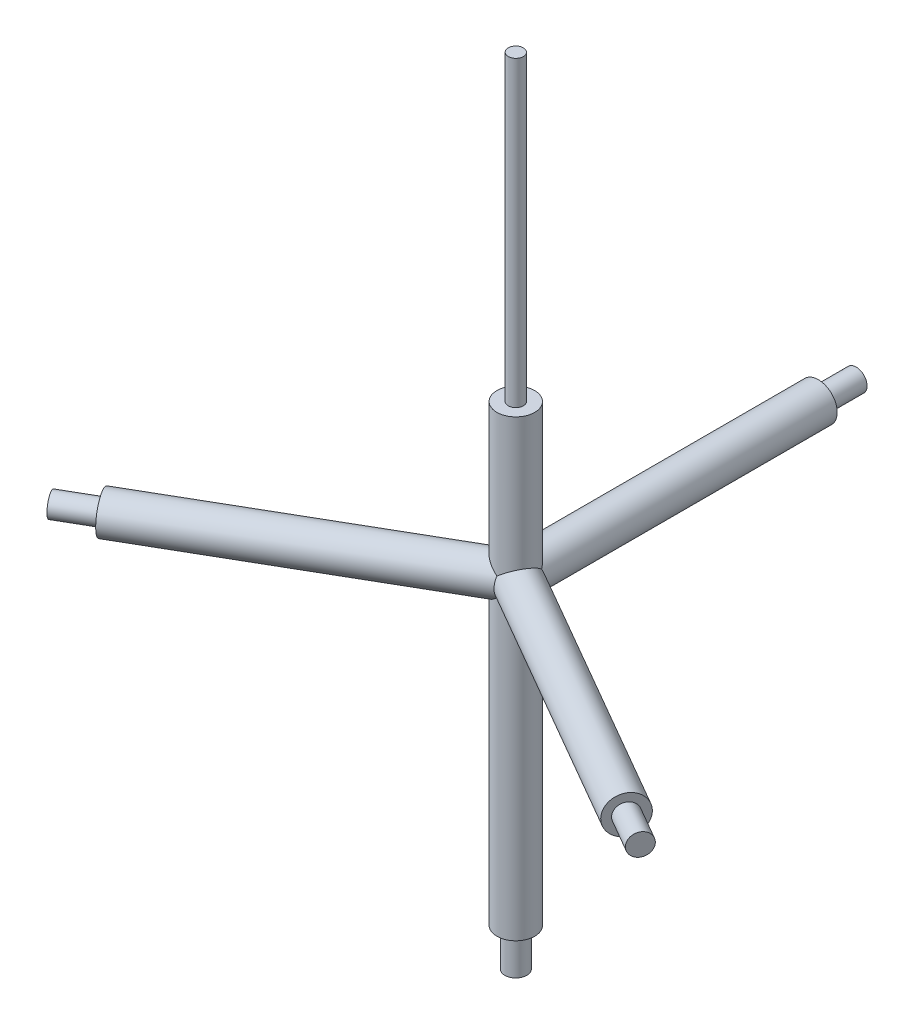
ISO-10303-21;
HEADER;
FILE_DESCRIPTION(('STEP AP214'),'2;1');
FILE_NAME('part.step','',(''),(''),'','','');
FILE_SCHEMA(('AUTOMOTIVE_DESIGN { 1 0 10303 214 1 1 1 1 }'));
ENDSEC;
DATA;
#1=APPLICATION_CONTEXT('core data for automotive mechanical design processes');
#2=APPLICATION_PROTOCOL_DEFINITION('international standard','automotive_design',2000,#1);
#3=PRODUCT_CONTEXT('',#1,'mechanical');
#4=PRODUCT('Part','Part','',(#3));
#5=PRODUCT_RELATED_PRODUCT_CATEGORY('part','',(#4));
#6=PRODUCT_DEFINITION_FORMATION('','',#4);
#7=PRODUCT_DEFINITION_CONTEXT('part definition',#1,'design');
#8=PRODUCT_DEFINITION('design','',#6,#7);
#9=PRODUCT_DEFINITION_SHAPE('','',#8);
#10=(LENGTH_UNIT() NAMED_UNIT(*) SI_UNIT(.MILLI.,.METRE.));
#11=(NAMED_UNIT(*) PLANE_ANGLE_UNIT() SI_UNIT($,.RADIAN.));
#12=(NAMED_UNIT(*) SI_UNIT($,.STERADIAN.) SOLID_ANGLE_UNIT());
#13=UNCERTAINTY_MEASURE_WITH_UNIT(LENGTH_MEASURE(1.E-05),#10,'distance_accuracy_value','');
#14=(GEOMETRIC_REPRESENTATION_CONTEXT(3) GLOBAL_UNCERTAINTY_ASSIGNED_CONTEXT((#13)) GLOBAL_UNIT_ASSIGNED_CONTEXT((#10,
#11,#12)) REPRESENTATION_CONTEXT('',''));
#15=CARTESIAN_POINT('',(0.,0.,0.));
#16=DIRECTION('',(0.,0.,1.));
#17=DIRECTION('',(1.,0.,0.));
#18=AXIS2_PLACEMENT_3D('',#15,#16,#17);
#19=CARTESIAN_POINT('',(0.,0.,0.));
#20=DIRECTION('',(0.,0.,1.));
#21=DIRECTION('',(1.,0.,0.));
#22=AXIS2_PLACEMENT_3D('',#19,#20,#21);
#23=CYLINDRICAL_SURFACE('',#22,2.5);
#24=CARTESIAN_POINT('',(0.,0.,0.));
#25=DIRECTION('',(0.,0.707106781186547,0.707106781186547));
#26=DIRECTION('',(0.,-0.707106781186547,0.707106781186547));
#27=AXIS2_PLACEMENT_3D('',#24,#25,#26);
#28=ELLIPSE('',#27,3.53553390593274,2.5);
#29=CARTESIAN_POINT('',(2.16506350946109,1.25000000000002,-1.25000000000001));
#30=VERTEX_POINT('',#29);
#31=CARTESIAN_POINT('',(-2.1650635094611,1.24999999999999,-1.25));
#32=VERTEX_POINT('',#31);
#33=EDGE_CURVE('E111',#30,#32,#28,.T.);
#34=ORIENTED_EDGE('',*,*,#33,.F.);
#35=CARTESIAN_POINT('',(0.,0.,0.));
#36=DIRECTION('',(0.500000000000004,0.,0.866025403784436));
#37=DIRECTION('',(-0.866025403784436,0.,0.500000000000004));
#38=AXIS2_PLACEMENT_3D('',#35,#36,#37);
#39=ELLIPSE('',#38,2.88675134594814,2.5);
#40=CARTESIAN_POINT('',(2.16506350946109,-1.25000000000001,-1.25000000000001));
#41=VERTEX_POINT('',#40);
#42=EDGE_CURVE('E106',#41,#30,#39,.T.);
#43=ORIENTED_EDGE('',*,*,#42,.F.);
#44=CARTESIAN_POINT('',(0.,0.,0.));
#45=DIRECTION('',(0.,-0.707106781186547,0.707106781186547));
#46=DIRECTION('',(0.,0.707106781186547,0.707106781186547));
#47=AXIS2_PLACEMENT_3D('',#44,#45,#46);
#48=ELLIPSE('',#47,3.53553390593274,2.5);
#49=CARTESIAN_POINT('',(-2.1650635094611,-1.24999999999999,-1.25));
#50=VERTEX_POINT('',#49);
#51=EDGE_CURVE('E53',#50,#41,#48,.T.);
#52=ORIENTED_EDGE('',*,*,#51,.F.);
#53=CARTESIAN_POINT('',(0.,0.,0.));
#54=DIRECTION('',(-0.499999999999998,0.,0.86602540378444));
#55=DIRECTION('',(0.86602540378444,0.,0.499999999999998));
#56=AXIS2_PLACEMENT_3D('',#53,#54,#55);
#57=ELLIPSE('',#56,2.88675134594813,2.5);
#58=EDGE_CURVE('E86',#32,#50,#57,.T.);
#59=ORIENTED_EDGE('',*,*,#58,.F.);
#60=EDGE_LOOP('',(#34,#43,#52,#59));
#61=FACE_BOUND('',#60,.T.);
#62=CARTESIAN_POINT('',(0.,0.,-40.));
#63=DIRECTION('',(0.,0.,1.));
#64=DIRECTION('',(1.,0.,0.));
#65=AXIS2_PLACEMENT_3D('',#62,#63,#64);
#66=CIRCLE('',#65,2.5);
#67=CARTESIAN_POINT('',(2.5,0.,-40.));
#68=VERTEX_POINT('',#67);
#69=EDGE_CURVE('E94',#68,#68,#66,.T.);
#70=ORIENTED_EDGE('',*,*,#69,.T.);
#71=EDGE_LOOP('',(#70));
#72=FACE_BOUND('',#71,.T.);
#73=ADVANCED_FACE('F37',(#61,#72),#23,.T.);
#74=CARTESIAN_POINT('',(0.,0.,-40.));
#75=DIRECTION('',(0.,0.,1.));
#76=DIRECTION('',(1.,0.,0.));
#77=AXIS2_PLACEMENT_3D('',#74,#75,#76);
#78=PLANE('',#77);
#79=CARTESIAN_POINT('',(0.,0.,-40.));
#80=DIRECTION('',(0.,0.,-1.));
#81=DIRECTION('',(-1.,0.,0.));
#82=AXIS2_PLACEMENT_3D('',#79,#80,#81);
#83=CIRCLE('',#82,1.45);
#84=CARTESIAN_POINT('',(-1.45,0.,-40.));
#85=VERTEX_POINT('',#84);
#86=EDGE_CURVE('E80',#85,#85,#83,.T.);
#87=ORIENTED_EDGE('',*,*,#86,.F.);
#88=EDGE_LOOP('',(#87));
#89=FACE_BOUND('',#88,.T.);
#90=ORIENTED_EDGE('',*,*,#69,.F.);
#91=EDGE_LOOP('',(#90));
#92=FACE_BOUND('',#91,.T.);
#93=ADVANCED_FACE('F166',(#89,#92),#78,.F.);
#94=CARTESIAN_POINT('',(0.,0.,-45.));
#95=DIRECTION('',(0.,0.,1.));
#96=DIRECTION('',(1.,0.,0.));
#97=AXIS2_PLACEMENT_3D('',#94,#95,#96);
#98=CYLINDRICAL_SURFACE('',#97,1.45);
#99=CARTESIAN_POINT('',(0.,0.,-45.));
#100=DIRECTION('',(0.,0.,-1.));
#101=DIRECTION('',(-1.,0.,0.));
#102=AXIS2_PLACEMENT_3D('',#99,#100,#101);
#103=CIRCLE('',#102,1.45);
#104=CARTESIAN_POINT('',(-1.45,0.,-45.));
#105=VERTEX_POINT('',#104);
#106=EDGE_CURVE('E97',#105,#105,#103,.T.);
#107=ORIENTED_EDGE('',*,*,#106,.F.);
#108=EDGE_LOOP('',(#107));
#109=FACE_BOUND('',#108,.T.);
#110=ORIENTED_EDGE('',*,*,#86,.T.);
#111=EDGE_LOOP('',(#110));
#112=FACE_BOUND('',#111,.T.);
#113=ADVANCED_FACE('F170',(#109,#112),#98,.T.);
#114=CARTESIAN_POINT('',(0.,0.,-45.));
#115=DIRECTION('',(0.,0.,-1.));
#116=DIRECTION('',(-1.,0.,0.));
#117=AXIS2_PLACEMENT_3D('',#114,#115,#116);
#118=PLANE('',#117);
#119=ORIENTED_EDGE('',*,*,#106,.T.);
#120=EDGE_LOOP('',(#119));
#121=FACE_BOUND('',#120,.T.);
#122=ADVANCED_FACE('F279',(#121),#118,.T.);
#123=CARTESIAN_POINT('',(0.,0.,0.));
#124=DIRECTION('',(0.866025403784436,0.,-0.500000000000004));
#125=DIRECTION('',(-0.500000000000004,0.,-0.866025403784436));
#126=AXIS2_PLACEMENT_3D('',#123,#124,#125);
#127=CYLINDRICAL_SURFACE('',#126,2.5);
#128=CARTESIAN_POINT('',(0.,0.,0.));
#129=DIRECTION('',(0.612372435695792,0.707106781186549,-0.353553390593276));
#130=DIRECTION('',(0.612372435695794,-0.707106781186546,-0.353553390593277));
#131=AXIS2_PLACEMENT_3D('',#128,#129,#130);
#132=ELLIPSE('',#131,3.53553390593273,2.5);
#133=CARTESIAN_POINT('',(0.,1.25,2.5));
#134=VERTEX_POINT('',#133);
#135=EDGE_CURVE('E60',#32,#134,#132,.T.);
#136=ORIENTED_EDGE('',*,*,#135,.F.);
#137=ORIENTED_EDGE('',*,*,#58,.T.);
#138=CARTESIAN_POINT('',(0.,0.,0.));
#139=DIRECTION('',(0.612372435695794,-0.707106781186546,-0.353553390593277));
#140=DIRECTION('',(0.612372435695792,0.707106781186549,-0.353553390593276));
#141=AXIS2_PLACEMENT_3D('',#138,#139,#140);
#142=ELLIPSE('',#141,3.53553390593274,2.5);
#143=CARTESIAN_POINT('',(0.,-1.25,2.5));
#144=VERTEX_POINT('',#143);
#145=EDGE_CURVE('E83',#144,#50,#142,.T.);
#146=ORIENTED_EDGE('',*,*,#145,.F.);
#147=CARTESIAN_POINT('',(0.,0.,0.));
#148=DIRECTION('',(1.,0.,0.));
#149=DIRECTION('',(0.,0.,-1.));
#150=AXIS2_PLACEMENT_3D('',#147,#148,#149);
#151=ELLIPSE('',#150,2.88675134594813,2.5);
#152=EDGE_CURVE('E73',#134,#144,#151,.T.);
#153=ORIENTED_EDGE('',*,*,#152,.F.);
#154=EDGE_LOOP('',(#136,#137,#146,#153));
#155=FACE_BOUND('',#154,.T.);
#156=CARTESIAN_POINT('',(-34.6410161513775,-1.20948461451098E-13,20.0000000000002));
#157=DIRECTION('',(0.866025403784436,0.,-0.500000000000004));
#158=DIRECTION('',(-0.500000000000004,0.,-0.866025403784436));
#159=AXIS2_PLACEMENT_3D('',#156,#157,#158);
#160=CIRCLE('',#159,2.5);
#161=CARTESIAN_POINT('',(-35.8910161513775,-1.3404151647176E-13,17.8349364905391));
#162=VERTEX_POINT('',#161);
#163=EDGE_CURVE('E103',#162,#162,#160,.T.);
#164=ORIENTED_EDGE('',*,*,#163,.T.);
#165=EDGE_LOOP('',(#164));
#166=FACE_BOUND('',#165,.T.);
#167=ADVANCED_FACE('F84',(#155,#166),#127,.T.);
#168=CARTESIAN_POINT('',(-34.6410161513775,-1.20948461451098E-13,20.0000000000002));
#169=DIRECTION('',(0.866025403784436,0.,-0.500000000000004));
#170=DIRECTION('',(-0.500000000000004,0.,-0.866025403784436));
#171=AXIS2_PLACEMENT_3D('',#168,#169,#170);
#172=PLANE('',#171);
#173=CARTESIAN_POINT('',(-34.6410161513775,-1.20948461451098E-13,20.0000000000002));
#174=DIRECTION('',(-0.866025403784436,0.,0.500000000000004));
#175=DIRECTION('',(0.500000000000004,0.,0.866025403784436));
#176=AXIS2_PLACEMENT_3D('',#173,#174,#175);
#177=CIRCLE('',#176,1.45);
#178=CARTESIAN_POINT('',(-33.9160161513775,-1.13354489539114E-13,21.2557368354876));
#179=VERTEX_POINT('',#178);
#180=EDGE_CURVE('E124',#179,#179,#177,.T.);
#181=ORIENTED_EDGE('',*,*,#180,.F.);
#182=EDGE_LOOP('',(#181));
#183=FACE_BOUND('',#182,.T.);
#184=ORIENTED_EDGE('',*,*,#163,.F.);
#185=EDGE_LOOP('',(#184));
#186=FACE_BOUND('',#185,.T.);
#187=ADVANCED_FACE('F268',(#183,#186),#172,.F.);
#188=CARTESIAN_POINT('',(0.,0.,0.));
#189=DIRECTION('',(-0.866025403784443,0.,-0.499999999999992));
#190=DIRECTION('',(-0.499999999999992,0.,0.866025403784443));
#191=AXIS2_PLACEMENT_3D('',#188,#189,#190);
#192=CYLINDRICAL_SURFACE('',#191,2.5);
#193=CARTESIAN_POINT('',(0.,0.,0.));
#194=DIRECTION('',(-0.612372435695799,0.707106781186546,-0.353553390593269));
#195=DIRECTION('',(-0.612372435695797,-0.707106781186549,-0.353553390593268));
#196=AXIS2_PLACEMENT_3D('',#193,#194,#195);
#197=ELLIPSE('',#196,3.53553390593274,2.5);
#198=EDGE_CURVE('E40',#134,#30,#197,.T.);
#199=ORIENTED_EDGE('',*,*,#198,.F.);
#200=ORIENTED_EDGE('',*,*,#152,.T.);
#201=CARTESIAN_POINT('',(0.,0.,0.));
#202=DIRECTION('',(-0.612372435695797,-0.707106781186549,-0.353553390593268));
#203=DIRECTION('',(-0.612372435695799,0.707106781186546,-0.353553390593269));
#204=AXIS2_PLACEMENT_3D('',#201,#202,#203);
#205=ELLIPSE('',#204,3.53553390593273,2.5);
#206=EDGE_CURVE('E78',#41,#144,#205,.T.);
#207=ORIENTED_EDGE('',*,*,#206,.F.);
#208=ORIENTED_EDGE('',*,*,#42,.T.);
#209=EDGE_LOOP('',(#199,#200,#207,#208));
#210=FACE_BOUND('',#209,.T.);
#211=CARTESIAN_POINT('',(34.6410161513777,1.20948461451099E-13,19.9999999999997));
#212=DIRECTION('',(-0.866025403784443,0.,-0.499999999999992));
#213=DIRECTION('',(-0.499999999999992,0.,0.866025403784443));
#214=AXIS2_PLACEMENT_3D('',#211,#212,#213);
#215=CIRCLE('',#214,2.5);
#216=CARTESIAN_POINT('',(33.3910161513778,1.07855406430437E-13,22.1650635094608));
#217=VERTEX_POINT('',#216);
#218=EDGE_CURVE('E108',#217,#217,#215,.T.);
#219=ORIENTED_EDGE('',*,*,#218,.T.);
#220=EDGE_LOOP('',(#219));
#221=FACE_BOUND('',#220,.T.);
#222=ADVANCED_FACE('F75',(#210,#221),#192,.T.);
#223=CARTESIAN_POINT('',(34.6410161513777,1.20948461451099E-13,19.9999999999997));
#224=DIRECTION('',(-0.866025403784443,0.,-0.499999999999992));
#225=DIRECTION('',(-0.499999999999992,0.,0.866025403784443));
#226=AXIS2_PLACEMENT_3D('',#223,#224,#225);
#227=PLANE('',#226);
#228=CARTESIAN_POINT('',(34.6410161513777,1.20948461451099E-13,19.9999999999997));
#229=DIRECTION('',(0.866025403784443,0.,0.499999999999992));
#230=DIRECTION('',(0.499999999999992,0.,-0.866025403784443));
#231=AXIS2_PLACEMENT_3D('',#228,#229,#230);
#232=CIRCLE('',#231,1.45);
#233=CARTESIAN_POINT('',(35.3660161513777,1.28542433363083E-13,18.7442631645122));
#234=VERTEX_POINT('',#233);
#235=EDGE_CURVE('E45',#234,#234,#232,.T.);
#236=ORIENTED_EDGE('',*,*,#235,.F.);
#237=EDGE_LOOP('',(#236));
#238=FACE_BOUND('',#237,.T.);
#239=ORIENTED_EDGE('',*,*,#218,.F.);
#240=EDGE_LOOP('',(#239));
#241=FACE_BOUND('',#240,.T.);
#242=ADVANCED_FACE('F153',(#238,#241),#227,.F.);
#243=CARTESIAN_POINT('',(0.,-40.,0.));
#244=DIRECTION('',(0.,1.,0.));
#245=DIRECTION('',(0.,0.,1.));
#246=AXIS2_PLACEMENT_3D('',#243,#244,#245);
#247=PLANE('',#246);
#248=CARTESIAN_POINT('',(0.,-40.,0.));
#249=DIRECTION('',(0.,-1.,0.));
#250=DIRECTION('',(0.,0.,-1.));
#251=AXIS2_PLACEMENT_3D('',#248,#249,#250);
#252=CIRCLE('',#251,1.45);
#253=CARTESIAN_POINT('',(0.,-40.,-1.45));
#254=VERTEX_POINT('',#253);
#255=EDGE_CURVE('E11',#254,#254,#252,.T.);
#256=ORIENTED_EDGE('',*,*,#255,.F.);
#257=EDGE_LOOP('',(#256));
#258=FACE_BOUND('',#257,.T.);
#259=CARTESIAN_POINT('',(0.,-40.,0.));
#260=DIRECTION('',(0.,1.,0.));
#261=DIRECTION('',(0.,0.,1.));
#262=AXIS2_PLACEMENT_3D('',#259,#260,#261);
#263=CIRCLE('',#262,2.5);
#264=CARTESIAN_POINT('',(0.,-40.,2.5));
#265=VERTEX_POINT('',#264);
#266=EDGE_CURVE('E88',#265,#265,#263,.T.);
#267=ORIENTED_EDGE('',*,*,#266,.F.);
#268=EDGE_LOOP('',(#267));
#269=FACE_BOUND('',#268,.T.);
#270=ADVANCED_FACE('F150',(#258,#269),#247,.F.);
#271=CARTESIAN_POINT('',(0.,-40.,0.));
#272=DIRECTION('',(0.,1.,0.));
#273=DIRECTION('',(0.,0.,1.));
#274=AXIS2_PLACEMENT_3D('',#271,#272,#273);
#275=CYLINDRICAL_SURFACE('',#274,2.5);
#276=ORIENTED_EDGE('',*,*,#145,.T.);
#277=ORIENTED_EDGE('',*,*,#51,.T.);
#278=ORIENTED_EDGE('',*,*,#206,.T.);
#279=EDGE_LOOP('',(#276,#277,#278));
#280=FACE_BOUND('',#279,.T.);
#281=ORIENTED_EDGE('',*,*,#266,.T.);
#282=EDGE_LOOP('',(#281));
#283=FACE_BOUND('',#282,.T.);
#284=ADVANCED_FACE('F90',(#280,#283),#275,.T.);
#285=ORIENTED_EDGE('',*,*,#198,.T.);
#286=ORIENTED_EDGE('',*,*,#33,.T.);
#287=ORIENTED_EDGE('',*,*,#135,.T.);
#288=EDGE_LOOP('',(#285,#286,#287));
#289=FACE_BOUND('',#288,.T.);
#290=CARTESIAN_POINT('',(0.,20.,0.));
#291=DIRECTION('',(0.,1.,0.));
#292=DIRECTION('',(0.,0.,1.));
#293=AXIS2_PLACEMENT_3D('',#290,#291,#292);
#294=CIRCLE('',#293,2.5);
#295=CARTESIAN_POINT('',(0.,20.,2.5));
#296=VERTEX_POINT('',#295);
#297=EDGE_CURVE('E118',#296,#296,#294,.T.);
#298=ORIENTED_EDGE('',*,*,#297,.F.);
#299=EDGE_LOOP('',(#298));
#300=FACE_BOUND('',#299,.T.);
#301=ADVANCED_FACE('F157',(#289,#300),#275,.T.);
#302=CARTESIAN_POINT('',(0.,20.,0.));
#303=DIRECTION('',(0.,1.,0.));
#304=DIRECTION('',(0.,0.,1.));
#305=AXIS2_PLACEMENT_3D('',#302,#303,#304);
#306=PLANE('',#305);
#307=CARTESIAN_POINT('',(0.,20.,0.));
#308=DIRECTION('',(0.,1.,0.));
#309=DIRECTION('',(0.,0.,1.));
#310=AXIS2_PLACEMENT_3D('',#307,#308,#309);
#311=CIRCLE('',#310,1.);
#312=CARTESIAN_POINT('',(0.,20.,1.));
#313=VERTEX_POINT('',#312);
#314=EDGE_CURVE('E92',#313,#313,#311,.T.);
#315=ORIENTED_EDGE('',*,*,#314,.F.);
#316=EDGE_LOOP('',(#315));
#317=FACE_BOUND('',#316,.T.);
#318=ORIENTED_EDGE('',*,*,#297,.T.);
#319=EDGE_LOOP('',(#318));
#320=FACE_BOUND('',#319,.T.);
#321=ADVANCED_FACE('F162',(#317,#320),#306,.T.);
#322=CARTESIAN_POINT('',(0.,60.,0.));
#323=DIRECTION('',(0.,-1.,0.));
#324=DIRECTION('',(0.,0.,-1.));
#325=AXIS2_PLACEMENT_3D('',#322,#323,#324);
#326=CYLINDRICAL_SURFACE('',#325,1.);
#327=CARTESIAN_POINT('',(0.,60.,0.));
#328=DIRECTION('',(0.,1.,0.));
#329=DIRECTION('',(0.,0.,1.));
#330=AXIS2_PLACEMENT_3D('',#327,#328,#329);
#331=CIRCLE('',#330,1.);
#332=CARTESIAN_POINT('',(0.,60.,1.));
#333=VERTEX_POINT('',#332);
#334=EDGE_CURVE('E121',#333,#333,#331,.T.);
#335=ORIENTED_EDGE('',*,*,#334,.F.);
#336=EDGE_LOOP('',(#335));
#337=FACE_BOUND('',#336,.T.);
#338=ORIENTED_EDGE('',*,*,#314,.T.);
#339=EDGE_LOOP('',(#338));
#340=FACE_BOUND('',#339,.T.);
#341=ADVANCED_FACE('F180',(#337,#340),#326,.T.);
#342=CARTESIAN_POINT('',(0.,60.,0.));
#343=DIRECTION('',(0.,1.,0.));
#344=DIRECTION('',(0.,0.,1.));
#345=AXIS2_PLACEMENT_3D('',#342,#343,#344);
#346=PLANE('',#345);
#347=ORIENTED_EDGE('',*,*,#334,.T.);
#348=EDGE_LOOP('',(#347));
#349=FACE_BOUND('',#348,.T.);
#350=ADVANCED_FACE('F186',(#349),#346,.T.);
#351=CARTESIAN_POINT('',(-38.9711431702996,-1.36067019132485E-13,22.5000000000002));
#352=DIRECTION('',(0.866025403784436,0.,-0.500000000000004));
#353=DIRECTION('',(-0.500000000000004,0.,-0.866025403784436));
#354=AXIS2_PLACEMENT_3D('',#351,#352,#353);
#355=CYLINDRICAL_SURFACE('',#354,1.45);
#356=CARTESIAN_POINT('',(-38.9711431702996,-1.36067019132485E-13,22.5000000000002));
#357=DIRECTION('',(-0.866025403784436,0.,0.500000000000004));
#358=DIRECTION('',(0.500000000000004,0.,0.866025403784436));
#359=AXIS2_PLACEMENT_3D('',#356,#357,#358);
#360=CIRCLE('',#359,1.45);
#361=CARTESIAN_POINT('',(-38.2461431702996,-1.28473047220501E-13,23.7557368354876));
#362=VERTEX_POINT('',#361);
#363=EDGE_CURVE('E127',#362,#362,#360,.T.);
#364=ORIENTED_EDGE('',*,*,#363,.F.);
#365=EDGE_LOOP('',(#364));
#366=FACE_BOUND('',#365,.T.);
#367=ORIENTED_EDGE('',*,*,#180,.T.);
#368=EDGE_LOOP('',(#367));
#369=FACE_BOUND('',#368,.T.);
#370=ADVANCED_FACE('F193',(#366,#369),#355,.T.);
#371=CARTESIAN_POINT('',(-38.9711431702996,-1.36067019132485E-13,22.5000000000002));
#372=DIRECTION('',(-0.866025403784436,0.,0.500000000000004));
#373=DIRECTION('',(0.500000000000004,0.,0.866025403784436));
#374=AXIS2_PLACEMENT_3D('',#371,#372,#373);
#375=PLANE('',#374);
#376=ORIENTED_EDGE('',*,*,#363,.T.);
#377=EDGE_LOOP('',(#376));
#378=FACE_BOUND('',#377,.T.);
#379=ADVANCED_FACE('F197',(#378),#375,.T.);
#380=CARTESIAN_POINT('',(38.9711431702999,1.36067019132486E-13,22.4999999999996));
#381=DIRECTION('',(-0.866025403784443,0.,-0.499999999999992));
#382=DIRECTION('',(-0.499999999999992,0.,0.866025403784443));
#383=AXIS2_PLACEMENT_3D('',#380,#381,#382);
#384=CYLINDRICAL_SURFACE('',#383,1.45);
#385=CARTESIAN_POINT('',(38.9711431702999,1.36067019132486E-13,22.4999999999996));
#386=DIRECTION('',(0.866025403784443,0.,0.499999999999992));
#387=DIRECTION('',(0.499999999999992,0.,-0.866025403784443));
#388=AXIS2_PLACEMENT_3D('',#385,#386,#387);
#389=CIRCLE('',#388,1.45);
#390=CARTESIAN_POINT('',(39.6961431702999,1.4366099104447E-13,21.2442631645122));
#391=VERTEX_POINT('',#390);
#392=EDGE_CURVE('E132',#391,#391,#389,.T.);
#393=ORIENTED_EDGE('',*,*,#392,.F.);
#394=EDGE_LOOP('',(#393));
#395=FACE_BOUND('',#394,.T.);
#396=ORIENTED_EDGE('',*,*,#235,.T.);
#397=EDGE_LOOP('',(#396));
#398=FACE_BOUND('',#397,.T.);
#399=ADVANCED_FACE('F201',(#395,#398),#384,.T.);
#400=CARTESIAN_POINT('',(38.9711431702999,1.36067019132486E-13,22.4999999999996));
#401=DIRECTION('',(0.866025403784443,0.,0.499999999999992));
#402=DIRECTION('',(0.499999999999992,0.,-0.866025403784443));
#403=AXIS2_PLACEMENT_3D('',#400,#401,#402);
#404=PLANE('',#403);
#405=ORIENTED_EDGE('',*,*,#392,.T.);
#406=EDGE_LOOP('',(#405));
#407=FACE_BOUND('',#406,.T.);
#408=ADVANCED_FACE('F146',(#407),#404,.T.);
#409=CARTESIAN_POINT('',(0.,-45.,0.));
#410=DIRECTION('',(0.,1.,0.));
#411=DIRECTION('',(0.,0.,1.));
#412=AXIS2_PLACEMENT_3D('',#409,#410,#411);
#413=CYLINDRICAL_SURFACE('',#412,1.45);
#414=CARTESIAN_POINT('',(0.,-45.,0.));
#415=DIRECTION('',(0.,-1.,0.));
#416=DIRECTION('',(0.,0.,-1.));
#417=AXIS2_PLACEMENT_3D('',#414,#415,#416);
#418=CIRCLE('',#417,1.45);
#419=CARTESIAN_POINT('',(0.,-45.,-1.45));
#420=VERTEX_POINT('',#419);
#421=EDGE_CURVE('E136',#420,#420,#418,.T.);
#422=ORIENTED_EDGE('',*,*,#421,.F.);
#423=EDGE_LOOP('',(#422));
#424=FACE_BOUND('',#423,.T.);
#425=ORIENTED_EDGE('',*,*,#255,.T.);
#426=EDGE_LOOP('',(#425));
#427=FACE_BOUND('',#426,.T.);
#428=ADVANCED_FACE('F143',(#424,#427),#413,.T.);
#429=CARTESIAN_POINT('',(0.,-45.,0.));
#430=DIRECTION('',(0.,-1.,0.));
#431=DIRECTION('',(0.,0.,-1.));
#432=AXIS2_PLACEMENT_3D('',#429,#430,#431);
#433=PLANE('',#432);
#434=ORIENTED_EDGE('',*,*,#421,.T.);
#435=EDGE_LOOP('',(#434));
#436=FACE_BOUND('',#435,.T.);
#437=ADVANCED_FACE('F141',(#436),#433,.T.);
#438=CLOSED_SHELL('',(#73,#93,#113,#122,#167,#187,#222,#242,#270,#284,#301,#321,#341,#350,#370,
#379,#399,#408,#428,#437));
#439=MANIFOLD_SOLID_BREP('B2',#438);
#440=ADVANCED_BREP_SHAPE_REPRESENTATION('',(#18,#439),#14);
#441=SHAPE_DEFINITION_REPRESENTATION(#9,#440);
ENDSEC;
END-ISO-10303-21;
